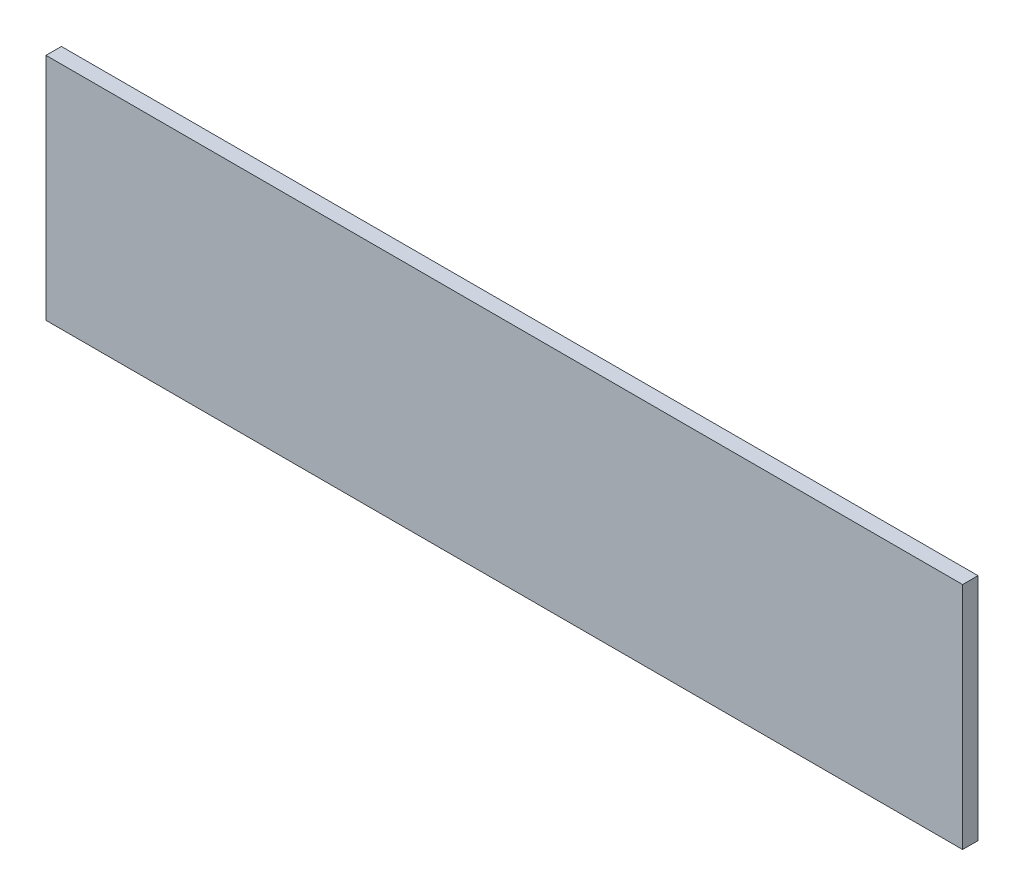
ISO-10303-21;
HEADER;
FILE_DESCRIPTION(('STEP AP214'),'2;1');
FILE_NAME('part.step','',(''),(''),'','','');
FILE_SCHEMA(('AUTOMOTIVE_DESIGN { 1 0 10303 214 1 1 1 1 }'));
ENDSEC;
DATA;
#1=APPLICATION_CONTEXT('core data for automotive mechanical design processes');
#2=APPLICATION_PROTOCOL_DEFINITION('international standard','automotive_design',2000,#1);
#3=PRODUCT_CONTEXT('',#1,'mechanical');
#4=PRODUCT('Part','Part','',(#3));
#5=PRODUCT_RELATED_PRODUCT_CATEGORY('part','',(#4));
#6=PRODUCT_DEFINITION_FORMATION('','',#4);
#7=PRODUCT_DEFINITION_CONTEXT('part definition',#1,'design');
#8=PRODUCT_DEFINITION('design','',#6,#7);
#9=PRODUCT_DEFINITION_SHAPE('','',#8);
#10=(LENGTH_UNIT() NAMED_UNIT(*) SI_UNIT(.MILLI.,.METRE.));
#11=(NAMED_UNIT(*) PLANE_ANGLE_UNIT() SI_UNIT($,.RADIAN.));
#12=(NAMED_UNIT(*) SI_UNIT($,.STERADIAN.) SOLID_ANGLE_UNIT());
#13=UNCERTAINTY_MEASURE_WITH_UNIT(LENGTH_MEASURE(1.E-05),#10,'distance_accuracy_value','');
#14=(GEOMETRIC_REPRESENTATION_CONTEXT(3) GLOBAL_UNCERTAINTY_ASSIGNED_CONTEXT((#13)) GLOBAL_UNIT_ASSIGNED_CONTEXT((#10,
#11,#12)) REPRESENTATION_CONTEXT('',''));
#15=CARTESIAN_POINT('',(0.,0.,0.));
#16=DIRECTION('',(0.,0.,1.));
#17=DIRECTION('',(1.,0.,0.));
#18=AXIS2_PLACEMENT_3D('',#15,#16,#17);
#19=CARTESIAN_POINT('',(0.,0.,1.3462));
#20=DIRECTION('',(1.,0.,0.));
#21=DIRECTION('',(0.,0.,-1.));
#22=AXIS2_PLACEMENT_3D('',#19,#20,#21);
#23=PLANE('',#22);
#24=DIRECTION('',(0.,-1.,0.));
#25=VECTOR('',#24,1.);
#26=CARTESIAN_POINT('',(0.,0.,0.));
#27=LINE('',#26,#25);
#28=CARTESIAN_POINT('',(0.,20.066,0.));
#29=VERTEX_POINT('',#28);
#30=CARTESIAN_POINT('',(0.,0.,0.));
#31=VERTEX_POINT('',#30);
#32=EDGE_CURVE('E96',#29,#31,#27,.T.);
#33=ORIENTED_EDGE('',*,*,#32,.T.);
#34=DIRECTION('',(0.,0.,-1.));
#35=VECTOR('',#34,1.);
#36=CARTESIAN_POINT('',(0.,0.,1.3462));
#37=LINE('',#36,#35);
#38=CARTESIAN_POINT('',(0.,0.,1.3462));
#39=VERTEX_POINT('',#38);
#40=EDGE_CURVE('E11',#39,#31,#37,.T.);
#41=ORIENTED_EDGE('',*,*,#40,.F.);
#42=DIRECTION('',(0.,-1.,0.));
#43=VECTOR('',#42,1.);
#44=CARTESIAN_POINT('',(0.,0.,1.3462));
#45=LINE('',#44,#43);
#46=CARTESIAN_POINT('',(0.,20.066,1.3462));
#47=VERTEX_POINT('',#46);
#48=EDGE_CURVE('E84',#47,#39,#45,.T.);
#49=ORIENTED_EDGE('',*,*,#48,.F.);
#50=DIRECTION('',(0.,0.,-1.));
#51=VECTOR('',#50,1.);
#52=CARTESIAN_POINT('',(0.,20.066,1.3462));
#53=LINE('',#52,#51);
#54=EDGE_CURVE('E92',#47,#29,#53,.T.);
#55=ORIENTED_EDGE('',*,*,#54,.T.);
#56=EDGE_LOOP('',(#33,#41,#49,#55));
#57=FACE_BOUND('',#56,.T.);
#58=ADVANCED_FACE('F33',(#57),#23,.F.);
#59=CARTESIAN_POINT('',(0.,0.,1.3462));
#60=DIRECTION('',(0.,1.,0.));
#61=DIRECTION('',(0.,0.,1.));
#62=AXIS2_PLACEMENT_3D('',#59,#60,#61);
#63=PLANE('',#62);
#64=DIRECTION('',(1.,0.,0.));
#65=VECTOR('',#64,1.);
#66=CARTESIAN_POINT('',(0.,0.,0.));
#67=LINE('',#66,#65);
#68=CARTESIAN_POINT('',(80.137,0.,0.));
#69=VERTEX_POINT('',#68);
#70=EDGE_CURVE('E88',#31,#69,#67,.T.);
#71=ORIENTED_EDGE('',*,*,#70,.T.);
#72=DIRECTION('',(0.,0.,-1.));
#73=VECTOR('',#72,1.);
#74=CARTESIAN_POINT('',(80.137,0.,1.3462));
#75=LINE('',#74,#73);
#76=CARTESIAN_POINT('',(80.137,0.,1.3462));
#77=VERTEX_POINT('',#76);
#78=EDGE_CURVE('E41',#77,#69,#75,.T.);
#79=ORIENTED_EDGE('',*,*,#78,.F.);
#80=DIRECTION('',(1.,0.,0.));
#81=VECTOR('',#80,1.);
#82=CARTESIAN_POINT('',(0.,0.,1.3462));
#83=LINE('',#82,#81);
#84=EDGE_CURVE('E79',#39,#77,#83,.T.);
#85=ORIENTED_EDGE('',*,*,#84,.F.);
#86=ORIENTED_EDGE('',*,*,#40,.T.);
#87=EDGE_LOOP('',(#71,#79,#85,#86));
#88=FACE_BOUND('',#87,.T.);
#89=ADVANCED_FACE('F87',(#88),#63,.F.);
#90=CARTESIAN_POINT('',(80.137,0.,1.3462));
#91=DIRECTION('',(-1.,0.,0.));
#92=DIRECTION('',(0.,0.,1.));
#93=AXIS2_PLACEMENT_3D('',#90,#91,#92);
#94=PLANE('',#93);
#95=DIRECTION('',(0.,1.,0.));
#96=VECTOR('',#95,1.);
#97=CARTESIAN_POINT('',(80.137,0.,0.));
#98=LINE('',#97,#96);
#99=CARTESIAN_POINT('',(80.137,20.066,0.));
#100=VERTEX_POINT('',#99);
#101=EDGE_CURVE('E66',#69,#100,#98,.T.);
#102=ORIENTED_EDGE('',*,*,#101,.T.);
#103=DIRECTION('',(0.,0.,-1.));
#104=VECTOR('',#103,1.);
#105=CARTESIAN_POINT('',(80.137,20.066,1.3462));
#106=LINE('',#105,#104);
#107=CARTESIAN_POINT('',(80.137,20.066,1.3462));
#108=VERTEX_POINT('',#107);
#109=EDGE_CURVE('E89',#108,#100,#106,.T.);
#110=ORIENTED_EDGE('',*,*,#109,.F.);
#111=DIRECTION('',(0.,1.,0.));
#112=VECTOR('',#111,1.);
#113=CARTESIAN_POINT('',(80.137,0.,1.3462));
#114=LINE('',#113,#112);
#115=EDGE_CURVE('E82',#77,#108,#114,.T.);
#116=ORIENTED_EDGE('',*,*,#115,.F.);
#117=ORIENTED_EDGE('',*,*,#78,.T.);
#118=EDGE_LOOP('',(#102,#110,#116,#117));
#119=FACE_BOUND('',#118,.T.);
#120=ADVANCED_FACE('F90',(#119),#94,.F.);
#121=CARTESIAN_POINT('',(0.,20.066,1.3462));
#122=DIRECTION('',(0.,-1.,0.));
#123=DIRECTION('',(0.,0.,-1.));
#124=AXIS2_PLACEMENT_3D('',#121,#122,#123);
#125=PLANE('',#124);
#126=DIRECTION('',(-1.,0.,0.));
#127=VECTOR('',#126,1.);
#128=CARTESIAN_POINT('',(0.,20.066,0.));
#129=LINE('',#128,#127);
#130=EDGE_CURVE('E72',#100,#29,#129,.T.);
#131=ORIENTED_EDGE('',*,*,#130,.T.);
#132=ORIENTED_EDGE('',*,*,#54,.F.);
#133=DIRECTION('',(-1.,0.,0.));
#134=VECTOR('',#133,1.);
#135=CARTESIAN_POINT('',(0.,20.066,1.3462));
#136=LINE('',#135,#134);
#137=EDGE_CURVE('E49',#108,#47,#136,.T.);
#138=ORIENTED_EDGE('',*,*,#137,.F.);
#139=ORIENTED_EDGE('',*,*,#109,.T.);
#140=EDGE_LOOP('',(#131,#132,#138,#139));
#141=FACE_BOUND('',#140,.T.);
#142=ADVANCED_FACE('F103',(#141),#125,.F.);
#143=CARTESIAN_POINT('',(0.,0.,1.3462));
#144=DIRECTION('',(0.,0.,-1.));
#145=DIRECTION('',(-1.,0.,0.));
#146=AXIS2_PLACEMENT_3D('',#143,#144,#145);
#147=PLANE('',#146);
#148=ORIENTED_EDGE('',*,*,#48,.T.);
#149=ORIENTED_EDGE('',*,*,#84,.T.);
#150=ORIENTED_EDGE('',*,*,#115,.T.);
#151=ORIENTED_EDGE('',*,*,#137,.T.);
#152=EDGE_LOOP('',(#148,#149,#150,#151));
#153=FACE_BOUND('',#152,.T.);
#154=ADVANCED_FACE('F80',(#153),#147,.F.);
#155=CARTESIAN_POINT('',(0.,0.,0.));
#156=DIRECTION('',(0.,0.,-1.));
#157=DIRECTION('',(-1.,0.,0.));
#158=AXIS2_PLACEMENT_3D('',#155,#156,#157);
#159=PLANE('',#158);
#160=ORIENTED_EDGE('',*,*,#32,.F.);
#161=ORIENTED_EDGE('',*,*,#130,.F.);
#162=ORIENTED_EDGE('',*,*,#101,.F.);
#163=ORIENTED_EDGE('',*,*,#70,.F.);
#164=EDGE_LOOP('',(#160,#161,#162,#163));
#165=FACE_BOUND('',#164,.T.);
#166=ADVANCED_FACE('F106',(#165),#159,.T.);
#167=CLOSED_SHELL('',(#58,#89,#120,#142,#154,#166));
#168=MANIFOLD_SOLID_BREP('B2',#167);
#169=ADVANCED_BREP_SHAPE_REPRESENTATION('',(#18,#168),#14);
#170=SHAPE_DEFINITION_REPRESENTATION(#9,#169);
ENDSEC;
END-ISO-10303-21;
